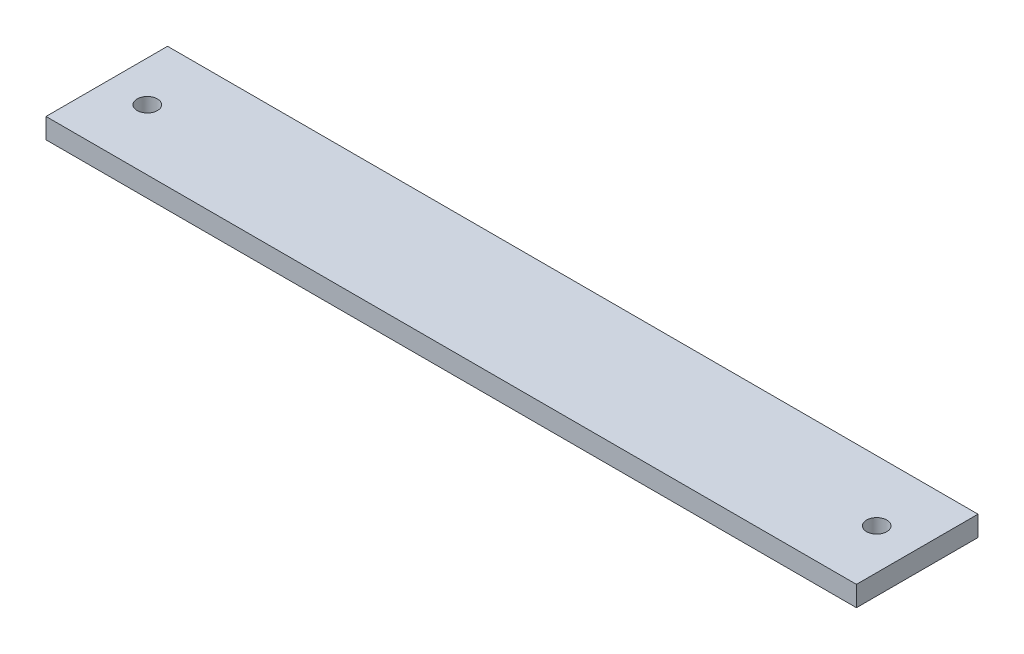
ISO-10303-21;
HEADER;
FILE_DESCRIPTION(('STEP AP214'),'2;1');
FILE_NAME('part.step','',(''),(''),'','','');
FILE_SCHEMA(('AUTOMOTIVE_DESIGN { 1 0 10303 214 1 1 1 1 }'));
ENDSEC;
DATA;
#1=APPLICATION_CONTEXT('core data for automotive mechanical design processes');
#2=APPLICATION_PROTOCOL_DEFINITION('international standard','automotive_design',2000,#1);
#3=PRODUCT_CONTEXT('',#1,'mechanical');
#4=PRODUCT('Part','Part','',(#3));
#5=PRODUCT_RELATED_PRODUCT_CATEGORY('part','',(#4));
#6=PRODUCT_DEFINITION_FORMATION('','',#4);
#7=PRODUCT_DEFINITION_CONTEXT('part definition',#1,'design');
#8=PRODUCT_DEFINITION('design','',#6,#7);
#9=PRODUCT_DEFINITION_SHAPE('','',#8);
#10=(LENGTH_UNIT() NAMED_UNIT(*) SI_UNIT(.MILLI.,.METRE.));
#11=(NAMED_UNIT(*) PLANE_ANGLE_UNIT() SI_UNIT($,.RADIAN.));
#12=(NAMED_UNIT(*) SI_UNIT($,.STERADIAN.) SOLID_ANGLE_UNIT());
#13=UNCERTAINTY_MEASURE_WITH_UNIT(LENGTH_MEASURE(1.E-05),#10,'distance_accuracy_value','');
#14=(GEOMETRIC_REPRESENTATION_CONTEXT(3) GLOBAL_UNCERTAINTY_ASSIGNED_CONTEXT((#13)) GLOBAL_UNIT_ASSIGNED_CONTEXT((#10,
#11,#12)) REPRESENTATION_CONTEXT('',''));
#15=CARTESIAN_POINT('',(0.,0.,0.));
#16=DIRECTION('',(0.,0.,1.));
#17=DIRECTION('',(1.,0.,0.));
#18=AXIS2_PLACEMENT_3D('',#15,#16,#17);
#19=CARTESIAN_POINT('',(0.,5.,0.));
#20=DIRECTION('',(0.,1.,0.));
#21=DIRECTION('',(0.,0.,1.));
#22=AXIS2_PLACEMENT_3D('',#19,#20,#21);
#23=PLANE('',#22);
#24=CARTESIAN_POINT('',(176.,5.,7.91666666666667));
#25=DIRECTION('',(0.,1.,0.));
#26=DIRECTION('',(0.,0.,1.));
#27=AXIS2_PLACEMENT_3D('',#24,#25,#26);
#28=CIRCLE('',#27,2.5);
#29=CARTESIAN_POINT('',(176.,5.,10.4166666666667));
#30=VERTEX_POINT('',#29);
#31=EDGE_CURVE('E100',#30,#30,#28,.T.);
#32=ORIENTED_EDGE('',*,*,#31,.F.);
#33=EDGE_LOOP('',(#32));
#34=FACE_BOUND('',#33,.T.);
#35=DIRECTION('',(0.,0.,1.));
#36=VECTOR('',#35,1.);
#37=CARTESIAN_POINT('',(-14.,5.,-7.08333333333333));
#38=LINE('',#37,#36);
#39=CARTESIAN_POINT('',(-14.,5.,-7.08333333333333));
#40=VERTEX_POINT('',#39);
#41=CARTESIAN_POINT('',(-14.,5.,22.9166666666667));
#42=VERTEX_POINT('',#41);
#43=EDGE_CURVE('E85',#40,#42,#38,.T.);
#44=ORIENTED_EDGE('',*,*,#43,.T.);
#45=DIRECTION('',(1.,0.,0.));
#46=VECTOR('',#45,1.);
#47=CARTESIAN_POINT('',(-14.,5.,22.9166666666667));
#48=LINE('',#47,#46);
#49=CARTESIAN_POINT('',(186.,5.,22.9166666666667));
#50=VERTEX_POINT('',#49);
#51=EDGE_CURVE('E80',#42,#50,#48,.T.);
#52=ORIENTED_EDGE('',*,*,#51,.T.);
#53=DIRECTION('',(0.,0.,-1.));
#54=VECTOR('',#53,1.);
#55=CARTESIAN_POINT('',(186.,5.,-7.08333333333333));
#56=LINE('',#55,#54);
#57=CARTESIAN_POINT('',(186.,5.,-7.08333333333333));
#58=VERTEX_POINT('',#57);
#59=EDGE_CURVE('E83',#50,#58,#56,.T.);
#60=ORIENTED_EDGE('',*,*,#59,.T.);
#61=DIRECTION('',(-1.,0.,0.));
#62=VECTOR('',#61,1.);
#63=CARTESIAN_POINT('',(-14.,5.,-7.08333333333333));
#64=LINE('',#63,#62);
#65=EDGE_CURVE('E50',#58,#40,#64,.T.);
#66=ORIENTED_EDGE('',*,*,#65,.T.);
#67=EDGE_LOOP('',(#44,#52,#60,#66));
#68=FACE_BOUND('',#67,.T.);
#69=CARTESIAN_POINT('',(-4.00000000000002,5.,7.91666666666667));
#70=DIRECTION('',(0.,1.,0.));
#71=DIRECTION('',(0.,0.,-1.));
#72=AXIS2_PLACEMENT_3D('',#69,#70,#71);
#73=CIRCLE('',#72,2.50000000000001);
#74=CARTESIAN_POINT('',(-4.00000000000002,5.,5.41666666666666));
#75=VERTEX_POINT('',#74);
#76=EDGE_CURVE('E115',#75,#75,#73,.T.);
#77=ORIENTED_EDGE('',*,*,#76,.F.);
#78=EDGE_LOOP('',(#77));
#79=FACE_BOUND('',#78,.T.);
#80=ADVANCED_FACE('F33',(#34,#68,#79),#23,.T.);
#81=CARTESIAN_POINT('',(0.,0.,0.));
#82=DIRECTION('',(0.,1.,0.));
#83=DIRECTION('',(0.,0.,1.));
#84=AXIS2_PLACEMENT_3D('',#81,#82,#83);
#85=PLANE('',#84);
#86=DIRECTION('',(0.,0.,1.));
#87=VECTOR('',#86,1.);
#88=CARTESIAN_POINT('',(-14.,0.,-7.08333333333333));
#89=LINE('',#88,#87);
#90=CARTESIAN_POINT('',(-14.,0.,-7.08333333333333));
#91=VERTEX_POINT('',#90);
#92=CARTESIAN_POINT('',(-14.,0.,22.9166666666667));
#93=VERTEX_POINT('',#92);
#94=EDGE_CURVE('E97',#91,#93,#89,.T.);
#95=ORIENTED_EDGE('',*,*,#94,.F.);
#96=DIRECTION('',(-1.,0.,0.));
#97=VECTOR('',#96,1.);
#98=CARTESIAN_POINT('',(-14.,0.,-7.08333333333333));
#99=LINE('',#98,#97);
#100=CARTESIAN_POINT('',(186.,0.,-7.08333333333333));
#101=VERTEX_POINT('',#100);
#102=EDGE_CURVE('E73',#101,#91,#99,.T.);
#103=ORIENTED_EDGE('',*,*,#102,.F.);
#104=DIRECTION('',(0.,0.,-1.));
#105=VECTOR('',#104,1.);
#106=CARTESIAN_POINT('',(186.,0.,-7.08333333333333));
#107=LINE('',#106,#105);
#108=CARTESIAN_POINT('',(186.,0.,22.9166666666667));
#109=VERTEX_POINT('',#108);
#110=EDGE_CURVE('E67',#109,#101,#107,.T.);
#111=ORIENTED_EDGE('',*,*,#110,.F.);
#112=DIRECTION('',(1.,0.,0.));
#113=VECTOR('',#112,1.);
#114=CARTESIAN_POINT('',(-14.,0.,22.9166666666667));
#115=LINE('',#114,#113);
#116=EDGE_CURVE('E89',#93,#109,#115,.T.);
#117=ORIENTED_EDGE('',*,*,#116,.F.);
#118=EDGE_LOOP('',(#95,#103,#111,#117));
#119=FACE_BOUND('',#118,.T.);
#120=CARTESIAN_POINT('',(176.,0.,7.91666666666667));
#121=DIRECTION('',(0.,1.,0.));
#122=DIRECTION('',(0.,0.,1.));
#123=AXIS2_PLACEMENT_3D('',#120,#121,#122);
#124=CIRCLE('',#123,2.5);
#125=CARTESIAN_POINT('',(176.,0.,10.4166666666667));
#126=VERTEX_POINT('',#125);
#127=EDGE_CURVE('E112',#126,#126,#124,.T.);
#128=ORIENTED_EDGE('',*,*,#127,.T.);
#129=EDGE_LOOP('',(#128));
#130=FACE_BOUND('',#129,.T.);
#131=CARTESIAN_POINT('',(-4.00000000000002,0.,7.91666666666667));
#132=DIRECTION('',(0.,1.,0.));
#133=DIRECTION('',(0.,0.,-1.));
#134=AXIS2_PLACEMENT_3D('',#131,#132,#133);
#135=CIRCLE('',#134,2.50000000000001);
#136=CARTESIAN_POINT('',(-4.00000000000002,0.,5.41666666666666));
#137=VERTEX_POINT('',#136);
#138=EDGE_CURVE('E118',#137,#137,#135,.T.);
#139=ORIENTED_EDGE('',*,*,#138,.T.);
#140=EDGE_LOOP('',(#139));
#141=FACE_BOUND('',#140,.T.);
#142=ADVANCED_FACE('F108',(#119,#130,#141),#85,.F.);
#143=CARTESIAN_POINT('',(-14.,5.,-7.08333333333333));
#144=DIRECTION('',(1.,0.,0.));
#145=DIRECTION('',(0.,0.,-1.));
#146=AXIS2_PLACEMENT_3D('',#143,#144,#145);
#147=PLANE('',#146);
#148=ORIENTED_EDGE('',*,*,#94,.T.);
#149=DIRECTION('',(0.,-1.,0.));
#150=VECTOR('',#149,1.);
#151=CARTESIAN_POINT('',(-14.,5.,22.9166666666667));
#152=LINE('',#151,#150);
#153=EDGE_CURVE('E11',#42,#93,#152,.T.);
#154=ORIENTED_EDGE('',*,*,#153,.F.);
#155=ORIENTED_EDGE('',*,*,#43,.F.);
#156=DIRECTION('',(0.,-1.,0.));
#157=VECTOR('',#156,1.);
#158=CARTESIAN_POINT('',(-14.,5.,-7.08333333333333));
#159=LINE('',#158,#157);
#160=EDGE_CURVE('E93',#40,#91,#159,.T.);
#161=ORIENTED_EDGE('',*,*,#160,.T.);
#162=EDGE_LOOP('',(#148,#154,#155,#161));
#163=FACE_BOUND('',#162,.T.);
#164=ADVANCED_FACE('F35',(#163),#147,.F.);
#165=CARTESIAN_POINT('',(-14.,5.,22.9166666666667));
#166=DIRECTION('',(0.,0.,-1.));
#167=DIRECTION('',(-1.,0.,0.));
#168=AXIS2_PLACEMENT_3D('',#165,#166,#167);
#169=PLANE('',#168);
#170=ORIENTED_EDGE('',*,*,#116,.T.);
#171=DIRECTION('',(0.,-1.,0.));
#172=VECTOR('',#171,1.);
#173=CARTESIAN_POINT('',(186.,5.,22.9166666666667));
#174=LINE('',#173,#172);
#175=EDGE_CURVE('E42',#50,#109,#174,.T.);
#176=ORIENTED_EDGE('',*,*,#175,.F.);
#177=ORIENTED_EDGE('',*,*,#51,.F.);
#178=ORIENTED_EDGE('',*,*,#153,.T.);
#179=EDGE_LOOP('',(#170,#176,#177,#178));
#180=FACE_BOUND('',#179,.T.);
#181=ADVANCED_FACE('F88',(#180),#169,.F.);
#182=CARTESIAN_POINT('',(186.,5.,-7.08333333333333));
#183=DIRECTION('',(-1.,0.,0.));
#184=DIRECTION('',(0.,0.,1.));
#185=AXIS2_PLACEMENT_3D('',#182,#183,#184);
#186=PLANE('',#185);
#187=ORIENTED_EDGE('',*,*,#110,.T.);
#188=DIRECTION('',(0.,-1.,0.));
#189=VECTOR('',#188,1.);
#190=CARTESIAN_POINT('',(186.,5.,-7.08333333333333));
#191=LINE('',#190,#189);
#192=EDGE_CURVE('E90',#58,#101,#191,.T.);
#193=ORIENTED_EDGE('',*,*,#192,.F.);
#194=ORIENTED_EDGE('',*,*,#59,.F.);
#195=ORIENTED_EDGE('',*,*,#175,.T.);
#196=EDGE_LOOP('',(#187,#193,#194,#195));
#197=FACE_BOUND('',#196,.T.);
#198=ADVANCED_FACE('F91',(#197),#186,.F.);
#199=CARTESIAN_POINT('',(-14.,5.,-7.08333333333333));
#200=DIRECTION('',(0.,0.,1.));
#201=DIRECTION('',(1.,0.,0.));
#202=AXIS2_PLACEMENT_3D('',#199,#200,#201);
#203=PLANE('',#202);
#204=ORIENTED_EDGE('',*,*,#102,.T.);
#205=ORIENTED_EDGE('',*,*,#160,.F.);
#206=ORIENTED_EDGE('',*,*,#65,.F.);
#207=ORIENTED_EDGE('',*,*,#192,.T.);
#208=EDGE_LOOP('',(#204,#205,#206,#207));
#209=FACE_BOUND('',#208,.T.);
#210=ADVANCED_FACE('F105',(#209),#203,.F.);
#211=CARTESIAN_POINT('',(176.,5.,7.91666666666667));
#212=DIRECTION('',(0.,-1.,0.));
#213=DIRECTION('',(0.,0.,-1.));
#214=AXIS2_PLACEMENT_3D('',#211,#212,#213);
#215=CYLINDRICAL_SURFACE('',#214,2.5);
#216=ORIENTED_EDGE('',*,*,#31,.T.);
#217=EDGE_LOOP('',(#216));
#218=FACE_BOUND('',#217,.T.);
#219=ORIENTED_EDGE('',*,*,#127,.F.);
#220=EDGE_LOOP('',(#219));
#221=FACE_BOUND('',#220,.T.);
#222=ADVANCED_FACE('F135',(#218,#221),#215,.F.);
#223=CARTESIAN_POINT('',(-4.00000000000002,5.,7.91666666666667));
#224=DIRECTION('',(0.,-1.,0.));
#225=DIRECTION('',(0.,0.,-1.));
#226=AXIS2_PLACEMENT_3D('',#223,#224,#225);
#227=CYLINDRICAL_SURFACE('',#226,2.50000000000001);
#228=ORIENTED_EDGE('',*,*,#76,.T.);
#229=EDGE_LOOP('',(#228));
#230=FACE_BOUND('',#229,.T.);
#231=ORIENTED_EDGE('',*,*,#138,.F.);
#232=EDGE_LOOP('',(#231));
#233=FACE_BOUND('',#232,.T.);
#234=ADVANCED_FACE('F124',(#230,#233),#227,.F.);
#235=CLOSED_SHELL('',(#80,#142,#164,#181,#198,#210,#222,#234));
#236=MANIFOLD_SOLID_BREP('B2',#235);
#237=ADVANCED_BREP_SHAPE_REPRESENTATION('',(#18,#236),#14);
#238=SHAPE_DEFINITION_REPRESENTATION(#9,#237);
ENDSEC;
END-ISO-10303-21;
